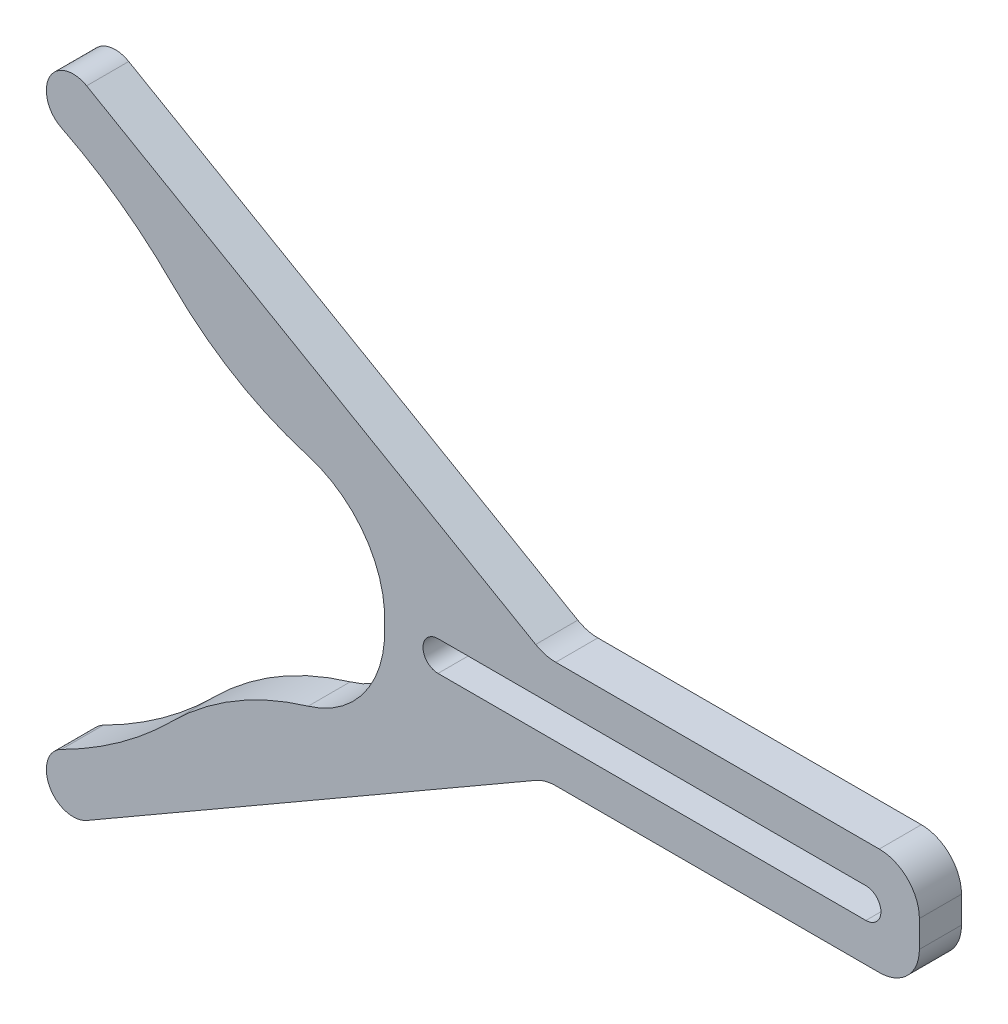
ISO-10303-21;
HEADER;
FILE_DESCRIPTION(('STEP AP214'),'2;1');
FILE_NAME('part.step','',(''),(''),'','','');
FILE_SCHEMA(('AUTOMOTIVE_DESIGN { 1 0 10303 214 1 1 1 1 }'));
ENDSEC;
DATA;
#1=APPLICATION_CONTEXT('core data for automotive mechanical design processes');
#2=APPLICATION_PROTOCOL_DEFINITION('international standard','automotive_design',2000,#1);
#3=PRODUCT_CONTEXT('',#1,'mechanical');
#4=PRODUCT('Part','Part','',(#3));
#5=PRODUCT_RELATED_PRODUCT_CATEGORY('part','',(#4));
#6=PRODUCT_DEFINITION_FORMATION('','',#4);
#7=PRODUCT_DEFINITION_CONTEXT('part definition',#1,'design');
#8=PRODUCT_DEFINITION('design','',#6,#7);
#9=PRODUCT_DEFINITION_SHAPE('','',#8);
#10=(LENGTH_UNIT() NAMED_UNIT(*) SI_UNIT(.MILLI.,.METRE.));
#11=(NAMED_UNIT(*) PLANE_ANGLE_UNIT() SI_UNIT($,.RADIAN.));
#12=(NAMED_UNIT(*) SI_UNIT($,.STERADIAN.) SOLID_ANGLE_UNIT());
#13=UNCERTAINTY_MEASURE_WITH_UNIT(LENGTH_MEASURE(1.E-05),#10,'distance_accuracy_value','');
#14=(GEOMETRIC_REPRESENTATION_CONTEXT(3) GLOBAL_UNCERTAINTY_ASSIGNED_CONTEXT((#13)) GLOBAL_UNIT_ASSIGNED_CONTEXT((#10,
#11,#12)) REPRESENTATION_CONTEXT('',''));
#15=CARTESIAN_POINT('',(0.,0.,0.));
#16=DIRECTION('',(0.,0.,1.));
#17=DIRECTION('',(1.,0.,0.));
#18=AXIS2_PLACEMENT_3D('',#15,#16,#17);
#19=CARTESIAN_POINT('',(-7.04849999999996,-133.35,0.));
#20=DIRECTION('',(0.,0.,1.));
#21=DIRECTION('',(1.,0.,0.));
#22=AXIS2_PLACEMENT_3D('',#19,#20,#21);
#23=PLANE('',#22);
#24=DIRECTION('',(1.,0.,0.));
#25=VECTOR('',#24,1.);
#26=CARTESIAN_POINT('',(126.3015,-8.33437499999997,0.));
#27=LINE('',#26,#25);
#28=CARTESIAN_POINT('',(24.7015,-8.334375,0.));
#29=VERTEX_POINT('',#28);
#30=CARTESIAN_POINT('',(126.3015,-8.33437499999997,0.));
#31=VERTEX_POINT('',#30);
#32=EDGE_CURVE('E213',#29,#31,#27,.T.);
#33=ORIENTED_EDGE('',*,*,#32,.T.);
#34=CARTESIAN_POINT('',(126.3015,-4.76249999999999,0.));
#35=DIRECTION('',(0.,0.,1.));
#36=DIRECTION('',(-1.,0.,0.));
#37=AXIS2_PLACEMENT_3D('',#34,#35,#36);
#38=CIRCLE('',#37,3.571875);
#39=CARTESIAN_POINT('',(126.3015,-1.19062499999997,0.));
#40=VERTEX_POINT('',#39);
#41=EDGE_CURVE('E205',#31,#40,#38,.T.);
#42=ORIENTED_EDGE('',*,*,#41,.T.);
#43=DIRECTION('',(-1.,0.,0.));
#44=VECTOR('',#43,1.);
#45=CARTESIAN_POINT('',(126.3015,-1.19062499999997,0.));
#46=LINE('',#45,#44);
#47=CARTESIAN_POINT('',(24.7015,-1.19062499999997,0.));
#48=VERTEX_POINT('',#47);
#49=EDGE_CURVE('E217',#40,#48,#46,.T.);
#50=ORIENTED_EDGE('',*,*,#49,.T.);
#51=CARTESIAN_POINT('',(24.7015,-4.7625,0.));
#52=DIRECTION('',(0.,0.,1.));
#53=DIRECTION('',(1.,0.,0.));
#54=AXIS2_PLACEMENT_3D('',#51,#52,#53);
#55=CIRCLE('',#54,3.571875);
#56=EDGE_CURVE('E221',#48,#29,#55,.T.);
#57=ORIENTED_EDGE('',*,*,#56,.T.);
#58=EDGE_LOOP('',(#33,#42,#50,#57));
#59=FACE_BOUND('',#58,.T.);
#60=DIRECTION('',(-0.866025403784438,-0.500000000000001,0.));
#61=VECTOR('',#60,1.);
#62=CARTESIAN_POINT('',(-42.9417594905346,-71.1810509131405,0.));
#63=LINE('',#62,#61);
#64=CARTESIAN_POINT('',(47.8912160579065,-18.7386080289532,0.));
#65=VERTEX_POINT('',#64);
#66=CARTESIAN_POINT('',(-58.7375,-80.3007259483298,0.));
#67=VERTEX_POINT('',#66);
#68=EDGE_CURVE('E258',#65,#67,#63,.T.);
#69=ORIENTED_EDGE('',*,*,#68,.T.);
#70=CARTESIAN_POINT('',(-61.9125,-74.8014646342987,0.));
#71=DIRECTION('',(0.,0.,1.));
#72=DIRECTION('',(1.,0.,0.));
#73=AXIS2_PLACEMENT_3D('',#70,#71,#72);
#74=CIRCLE('',#73,6.35);
#75=CARTESIAN_POINT('',(-68.2625,-74.8014646342987,0.));
#76=VERTEX_POINT('',#75);
#77=EDGE_CURVE('E407',#67,#76,#74,.F.);
#78=ORIENTED_EDGE('',*,*,#77,.T.);
#79=DIRECTION('',(0.,1.,0.));
#80=VECTOR('',#79,1.);
#81=CARTESIAN_POINT('',(-68.2625,-76.2,0.));
#82=LINE('',#81,#80);
#83=CARTESIAN_POINT('',(-68.2625,-74.375116540716,0.));
#84=VERTEX_POINT('',#83);
#85=EDGE_CURVE('E275',#76,#84,#82,.T.);
#86=ORIENTED_EDGE('',*,*,#85,.T.);
#87=CARTESIAN_POINT('',(-61.9125,-74.375116540716,0.));
#88=DIRECTION('',(0.,0.,-1.));
#89=DIRECTION('',(-1.,0.,0.));
#90=AXIS2_PLACEMENT_3D('',#87,#88,#89);
#91=CIRCLE('',#90,6.34999999999997);
#92=CARTESIAN_POINT('',(-64.7523099037181,-68.6955056640146,0.));
#93=VERTEX_POINT('',#92);
#94=EDGE_CURVE('E279',#93,#84,#91,.F.);
#95=ORIENTED_EDGE('',*,*,#94,.F.);
#96=CARTESIAN_POINT('',(-110.189268363208,22.1782683632083,0.));
#97=DIRECTION('',(0.,0.,-1.));
#98=DIRECTION('',(-1.,0.,0.));
#99=AXIS2_PLACEMENT_3D('',#96,#97,#98);
#100=CIRCLE('',#99,101.600000000001);
#101=CARTESIAN_POINT('',(-38.3472193946545,-49.6637806053459,0.));
#102=VERTEX_POINT('',#101);
#103=EDGE_CURVE('E282',#93,#102,#100,.F.);
#104=ORIENTED_EDGE('',*,*,#103,.T.);
#105=CARTESIAN_POINT('',(15.5343173317604,-103.545317331762,0.));
#106=DIRECTION('',(0.,0.,-1.));
#107=DIRECTION('',(-1.,0.,0.));
#108=AXIS2_PLACEMENT_3D('',#105,#106,#107);
#109=CIRCLE('',#108,76.2000000000004);
#110=CARTESIAN_POINT('',(-6.13722318006472,-30.4920194469679,0.));
#111=VERTEX_POINT('',#110);
#112=EDGE_CURVE('E286',#111,#102,#109,.F.);
#113=ORIENTED_EDGE('',*,*,#112,.F.);
#114=CARTESIAN_POINT('',(-13.3610700173397,-6.1409201520368,0.));
#115=DIRECTION('',(0.,0.,-1.));
#116=DIRECTION('',(-1.,0.,0.));
#117=AXIS2_PLACEMENT_3D('',#114,#115,#116);
#118=CIRCLE('',#117,25.4);
#119=CARTESIAN_POINT('',(12.0015,-4.76250000000001,0.));
#120=VERTEX_POINT('',#119);
#121=EDGE_CURVE('E289',#111,#120,#118,.F.);
#122=ORIENTED_EDGE('',*,*,#121,.T.);
#123=CARTESIAN_POINT('',(-13.3610700173397,-3.38407984796313,0.));
#124=DIRECTION('',(0.,0.,-1.));
#125=DIRECTION('',(-1.,0.,0.));
#126=AXIS2_PLACEMENT_3D('',#123,#124,#125);
#127=CIRCLE('',#126,25.4);
#128=CARTESIAN_POINT('',(-6.13722318006467,20.9670194469679,0.));
#129=VERTEX_POINT('',#128);
#130=EDGE_CURVE('E290',#120,#129,#127,.F.);
#131=ORIENTED_EDGE('',*,*,#130,.T.);
#132=CARTESIAN_POINT('',(15.5343173317605,94.0203173317616,0.));
#133=DIRECTION('',(0.,0.,-1.));
#134=DIRECTION('',(-1.,0.,0.));
#135=AXIS2_PLACEMENT_3D('',#132,#133,#134);
#136=CIRCLE('',#135,76.2000000000005);
#137=CARTESIAN_POINT('',(-38.3472193946544,40.1387806053459,0.));
#138=VERTEX_POINT('',#137);
#139=EDGE_CURVE('E296',#138,#129,#136,.F.);
#140=ORIENTED_EDGE('',*,*,#139,.F.);
#141=CARTESIAN_POINT('',(-110.189268363207,-31.703268363207,0.));
#142=DIRECTION('',(0.,0.,-1.));
#143=DIRECTION('',(-1.,0.,0.));
#144=AXIS2_PLACEMENT_3D('',#141,#142,#143);
#145=CIRCLE('',#144,101.599999999999);
#146=CARTESIAN_POINT('',(-64.752309903718,59.1705056640146,0.));
#147=VERTEX_POINT('',#146);
#148=EDGE_CURVE('E299',#138,#147,#145,.F.);
#149=ORIENTED_EDGE('',*,*,#148,.T.);
#150=CARTESIAN_POINT('',(-61.9125,64.850116540716,0.));
#151=DIRECTION('',(0.,0.,-1.));
#152=DIRECTION('',(-1.,0.,0.));
#153=AXIS2_PLACEMENT_3D('',#150,#151,#152);
#154=CIRCLE('',#153,6.35000000000001);
#155=CARTESIAN_POINT('',(-68.2625,64.8501164231919,0.));
#156=VERTEX_POINT('',#155);
#157=EDGE_CURVE('E303',#156,#147,#154,.F.);
#158=ORIENTED_EDGE('',*,*,#157,.F.);
#159=DIRECTION('',(-3.70154599632154E-08,0.999999999999999,0.));
#160=VECTOR('',#159,1.);
#161=CARTESIAN_POINT('',(-68.2625,64.8501165407159,0.));
#162=LINE('',#161,#160);
#163=CARTESIAN_POINT('',(-68.2625000157815,65.2764644083618,0.));
#164=VERTEX_POINT('',#163);
#165=EDGE_CURVE('E316',#156,#164,#162,.T.);
#166=ORIENTED_EDGE('',*,*,#165,.T.);
#167=CARTESIAN_POINT('',(-61.9125000157815,65.27646464341,0.));
#168=DIRECTION('',(0.,0.,1.));
#169=DIRECTION('',(1.,0.,0.));
#170=AXIS2_PLACEMENT_3D('',#167,#168,#169);
#171=CIRCLE('',#170,6.35);
#172=CARTESIAN_POINT('',(-58.7375000157815,70.7757259574412,0.));
#173=VERTEX_POINT('',#172);
#174=EDGE_CURVE('E405',#164,#173,#171,.F.);
#175=ORIENTED_EDGE('',*,*,#174,.T.);
#176=DIRECTION('',(0.866025403784438,-0.500000000000001,0.));
#177=VECTOR('',#176,1.);
#178=CARTESIAN_POINT('',(68.418282118597,-2.63769908685979,0.));
#179=LINE('',#178,#177);
#180=CARTESIAN_POINT('',(47.8912160579064,9.21360802895321,0.));
#181=VERTEX_POINT('',#180);
#182=EDGE_CURVE('E261',#173,#181,#179,.T.);
#183=ORIENTED_EDGE('',*,*,#182,.T.);
#184=CARTESIAN_POINT('',(52.6537160579064,17.4625,0.));
#185=DIRECTION('',(0.,0.,1.));
#186=DIRECTION('',(1.,0.,0.));
#187=AXIS2_PLACEMENT_3D('',#184,#185,#186);
#188=CIRCLE('',#187,9.525);
#189=CARTESIAN_POINT('',(52.6537160579064,7.93749999999996,0.));
#190=VERTEX_POINT('',#189);
#191=EDGE_CURVE('E396',#181,#190,#188,.T.);
#192=ORIENTED_EDGE('',*,*,#191,.T.);
#193=DIRECTION('',(1.,0.,0.));
#194=VECTOR('',#193,1.);
#195=CARTESIAN_POINT('',(-7.04850000000004,7.93749999999993,0.));
#196=LINE('',#195,#194);
#197=CARTESIAN_POINT('',(129.4765,7.93750000000001,0.));
#198=VERTEX_POINT('',#197);
#199=EDGE_CURVE('E252',#190,#198,#196,.T.);
#200=ORIENTED_EDGE('',*,*,#199,.T.);
#201=CARTESIAN_POINT('',(129.4765,-1.58749999999999,0.));
#202=DIRECTION('',(0.,0.,1.));
#203=DIRECTION('',(1.,0.,0.));
#204=AXIS2_PLACEMENT_3D('',#201,#202,#203);
#205=CIRCLE('',#204,9.525);
#206=CARTESIAN_POINT('',(139.0015,-1.58749999999999,0.));
#207=VERTEX_POINT('',#206);
#208=EDGE_CURVE('E383',#198,#207,#205,.F.);
#209=ORIENTED_EDGE('',*,*,#208,.T.);
#210=DIRECTION('',(0.,-1.,0.));
#211=VECTOR('',#210,1.);
#212=CARTESIAN_POINT('',(139.0015,147.6375,0.));
#213=LINE('',#212,#211);
#214=CARTESIAN_POINT('',(139.0015,-7.93749999999999,0.));
#215=VERTEX_POINT('',#214);
#216=EDGE_CURVE('E263',#207,#215,#213,.T.);
#217=ORIENTED_EDGE('',*,*,#216,.T.);
#218=CARTESIAN_POINT('',(129.4765,-7.93749999999998,0.));
#219=DIRECTION('',(0.,0.,1.));
#220=DIRECTION('',(1.,0.,0.));
#221=AXIS2_PLACEMENT_3D('',#218,#219,#220);
#222=CIRCLE('',#221,9.525);
#223=CARTESIAN_POINT('',(129.4765,-17.4625,0.));
#224=VERTEX_POINT('',#223);
#225=EDGE_CURVE('E381',#215,#224,#222,.F.);
#226=ORIENTED_EDGE('',*,*,#225,.T.);
#227=DIRECTION('',(-1.,0.,0.));
#228=VECTOR('',#227,1.);
#229=CARTESIAN_POINT('',(-7.04849999999995,-17.4625,0.));
#230=LINE('',#229,#228);
#231=CARTESIAN_POINT('',(52.6537160579065,-17.4625,0.));
#232=VERTEX_POINT('',#231);
#233=EDGE_CURVE('E255',#224,#232,#230,.T.);
#234=ORIENTED_EDGE('',*,*,#233,.T.);
#235=CARTESIAN_POINT('',(52.6537160579065,-26.9875,0.));
#236=DIRECTION('',(0.,0.,1.));
#237=DIRECTION('',(1.,0.,0.));
#238=AXIS2_PLACEMENT_3D('',#235,#236,#237);
#239=CIRCLE('',#238,9.525);
#240=EDGE_CURVE('E400',#232,#65,#239,.T.);
#241=ORIENTED_EDGE('',*,*,#240,.T.);
#242=EDGE_LOOP('',(#69,#78,#86,#95,#104,#113,#122,#131,#140,#149,#158,#166,#175,#183,#192,#200,
#209,#217,#226,#234,#241));
#243=FACE_BOUND('',#242,.T.);
#244=ADVANCED_FACE('F35',(#59,#243),#23,.F.);
#245=CARTESIAN_POINT('',(139.0015,147.6375,10.));
#246=DIRECTION('',(-1.,0.,0.));
#247=DIRECTION('',(0.,-1.,0.));
#248=AXIS2_PLACEMENT_3D('',#245,#246,#247);
#249=PLANE('',#248);
#250=ORIENTED_EDGE('',*,*,#216,.F.);
#251=DIRECTION('',(0.,0.,1.));
#252=VECTOR('',#251,1.);
#253=CARTESIAN_POINT('',(139.0015,-1.58749999999999,10.));
#254=LINE('',#253,#252);
#255=CARTESIAN_POINT('',(139.0015,-1.58749999999999,10.));
#256=VERTEX_POINT('',#255);
#257=EDGE_CURVE('E369',#207,#256,#254,.T.);
#258=ORIENTED_EDGE('',*,*,#257,.T.);
#259=DIRECTION('',(0.,1.,0.));
#260=VECTOR('',#259,1.);
#261=CARTESIAN_POINT('',(139.0015,-133.35,10.));
#262=LINE('',#261,#260);
#263=CARTESIAN_POINT('',(139.0015,-7.93749999999999,10.));
#264=VERTEX_POINT('',#263);
#265=EDGE_CURVE('E272',#264,#256,#262,.T.);
#266=ORIENTED_EDGE('',*,*,#265,.F.);
#267=DIRECTION('',(0.,0.,1.));
#268=VECTOR('',#267,1.);
#269=CARTESIAN_POINT('',(139.0015,-7.93749999999999,10.));
#270=LINE('',#269,#268);
#271=EDGE_CURVE('E317',#264,#215,#270,.F.);
#272=ORIENTED_EDGE('',*,*,#271,.T.);
#273=EDGE_LOOP('',(#250,#258,#266,#272));
#274=FACE_BOUND('',#273,.T.);
#275=ADVANCED_FACE('F424',(#274),#249,.F.);
#276=CARTESIAN_POINT('',(-68.2625,64.8501165407159,10.));
#277=DIRECTION('',(0.999999999999999,3.70154599632154E-08,0.));
#278=DIRECTION('',(-3.70154599632154E-08,0.999999999999999,0.));
#279=AXIS2_PLACEMENT_3D('',#276,#277,#278);
#280=PLANE('',#279);
#281=DIRECTION('',(0.,1.,0.));
#282=VECTOR('',#281,1.);
#283=CARTESIAN_POINT('',(-68.2625004201211,-133.35,10.));
#284=LINE('',#283,#282);
#285=CARTESIAN_POINT('',(-68.2625004201211,65.2764644083618,10.));
#286=VERTEX_POINT('',#285);
#287=CARTESIAN_POINT('',(-68.2625002100605,64.850116540716,10.));
#288=VERTEX_POINT('',#287);
#289=EDGE_CURVE('E269',#286,#288,#284,.F.);
#290=ORIENTED_EDGE('',*,*,#289,.F.);
#291=DIRECTION('',(0.,0.,1.));
#292=VECTOR('',#291,1.);
#293=CARTESIAN_POINT('',(-68.2625000157815,65.2764644083618,10.));
#294=LINE('',#293,#292);
#295=EDGE_CURVE('E11',#286,#164,#294,.F.);
#296=ORIENTED_EDGE('',*,*,#295,.T.);
#297=ORIENTED_EDGE('',*,*,#165,.F.);
#298=DIRECTION('',(0.,0.,-1.));
#299=VECTOR('',#298,1.);
#300=CARTESIAN_POINT('',(-68.2625,64.850116540716,10.));
#301=LINE('',#300,#299);
#302=EDGE_CURVE('E300',#288,#156,#301,.T.);
#303=ORIENTED_EDGE('',*,*,#302,.F.);
#304=EDGE_LOOP('',(#290,#296,#297,#303));
#305=FACE_BOUND('',#304,.T.);
#306=ADVANCED_FACE('F426',(#305),#280,.F.);
#307=CARTESIAN_POINT('',(-61.9125,64.850116540716,10.));
#308=DIRECTION('',(0.,0.,-1.));
#309=DIRECTION('',(-1.,0.,0.));
#310=AXIS2_PLACEMENT_3D('',#307,#308,#309);
#311=CYLINDRICAL_SURFACE('',#310,6.35000000000001);
#312=CARTESIAN_POINT('',(-61.9125,64.850116540716,10.));
#313=DIRECTION('',(0.,0.,-1.));
#314=DIRECTION('',(-1.,0.,0.));
#315=AXIS2_PLACEMENT_3D('',#312,#313,#314);
#316=CIRCLE('',#315,6.35000000000001);
#317=CARTESIAN_POINT('',(-64.752309903718,59.1705056640146,10.));
#318=VERTEX_POINT('',#317);
#319=EDGE_CURVE('E271',#288,#318,#316,.F.);
#320=ORIENTED_EDGE('',*,*,#319,.F.);
#321=ORIENTED_EDGE('',*,*,#302,.T.);
#322=ORIENTED_EDGE('',*,*,#157,.T.);
#323=DIRECTION('',(0.,0.,-1.));
#324=VECTOR('',#323,1.);
#325=CARTESIAN_POINT('',(-64.752309903718,59.1705056640145,10.));
#326=LINE('',#325,#324);
#327=EDGE_CURVE('E297',#147,#318,#326,.F.);
#328=ORIENTED_EDGE('',*,*,#327,.T.);
#329=EDGE_LOOP('',(#320,#321,#322,#328));
#330=FACE_BOUND('',#329,.T.);
#331=ADVANCED_FACE('F433',(#330),#311,.T.);
#332=CARTESIAN_POINT('',(-110.189268363207,-31.703268363207,10.));
#333=DIRECTION('',(0.,0.,-1.));
#334=DIRECTION('',(-1.,0.,0.));
#335=AXIS2_PLACEMENT_3D('',#332,#333,#334);
#336=CYLINDRICAL_SURFACE('',#335,101.599999999999);
#337=DIRECTION('',(0.,0.,-1.));
#338=VECTOR('',#337,1.);
#339=CARTESIAN_POINT('',(-38.3472193946543,40.1387806053458,10.));
#340=LINE('',#339,#338);
#341=CARTESIAN_POINT('',(-38.3472193946544,40.1387806053459,10.));
#342=VERTEX_POINT('',#341);
#343=EDGE_CURVE('E293',#342,#138,#340,.T.);
#344=ORIENTED_EDGE('',*,*,#343,.F.);
#345=CARTESIAN_POINT('',(-110.189268363207,-31.703268363207,10.));
#346=DIRECTION('',(0.,0.,-1.));
#347=DIRECTION('',(-1.,0.,0.));
#348=AXIS2_PLACEMENT_3D('',#345,#346,#347);
#349=CIRCLE('',#348,101.599999999999);
#350=EDGE_CURVE('E338',#318,#342,#349,.T.);
#351=ORIENTED_EDGE('',*,*,#350,.F.);
#352=ORIENTED_EDGE('',*,*,#327,.F.);
#353=ORIENTED_EDGE('',*,*,#148,.F.);
#354=EDGE_LOOP('',(#344,#351,#352,#353));
#355=FACE_BOUND('',#354,.T.);
#356=ADVANCED_FACE('F474',(#355),#336,.F.);
#357=CARTESIAN_POINT('',(15.5343173317605,94.0203173317616,10.));
#358=DIRECTION('',(0.,0.,-1.));
#359=DIRECTION('',(-1.,0.,0.));
#360=AXIS2_PLACEMENT_3D('',#357,#358,#359);
#361=CYLINDRICAL_SURFACE('',#360,76.2000000000005);
#362=CARTESIAN_POINT('',(15.5343173317605,94.0203173317616,10.));
#363=DIRECTION('',(0.,0.,-1.));
#364=DIRECTION('',(-1.,0.,0.));
#365=AXIS2_PLACEMENT_3D('',#362,#363,#364);
#366=CIRCLE('',#365,76.2000000000005);
#367=CARTESIAN_POINT('',(-6.13722318006467,20.9670194469679,10.));
#368=VERTEX_POINT('',#367);
#369=EDGE_CURVE('E335',#342,#368,#366,.F.);
#370=ORIENTED_EDGE('',*,*,#369,.F.);
#371=ORIENTED_EDGE('',*,*,#343,.T.);
#372=ORIENTED_EDGE('',*,*,#139,.T.);
#373=DIRECTION('',(0.,0.,-1.));
#374=VECTOR('',#373,1.);
#375=CARTESIAN_POINT('',(-6.13722318006467,20.9670194469679,10.));
#376=LINE('',#375,#374);
#377=EDGE_CURVE('E291',#129,#368,#376,.F.);
#378=ORIENTED_EDGE('',*,*,#377,.T.);
#379=EDGE_LOOP('',(#370,#371,#372,#378));
#380=FACE_BOUND('',#379,.T.);
#381=ADVANCED_FACE('F470',(#380),#361,.T.);
#382=CARTESIAN_POINT('',(-13.3610700173397,-3.38407984796313,10.));
#383=DIRECTION('',(0.,0.,-1.));
#384=DIRECTION('',(-1.,0.,0.));
#385=AXIS2_PLACEMENT_3D('',#382,#383,#384);
#386=CYLINDRICAL_SURFACE('',#385,25.4);
#387=DIRECTION('',(0.,0.,-1.));
#388=VECTOR('',#387,1.);
#389=CARTESIAN_POINT('',(12.0015,-4.7625,10.));
#390=LINE('',#389,#388);
#391=CARTESIAN_POINT('',(12.0015,-4.76250000000001,10.));
#392=VERTEX_POINT('',#391);
#393=EDGE_CURVE('E287',#120,#392,#390,.F.);
#394=ORIENTED_EDGE('',*,*,#393,.T.);
#395=CARTESIAN_POINT('',(-13.3610700173397,-3.38407984796313,10.));
#396=DIRECTION('',(0.,0.,-1.));
#397=DIRECTION('',(-1.,0.,0.));
#398=AXIS2_PLACEMENT_3D('',#395,#396,#397);
#399=CIRCLE('',#398,25.4);
#400=EDGE_CURVE('E332',#368,#392,#399,.T.);
#401=ORIENTED_EDGE('',*,*,#400,.F.);
#402=ORIENTED_EDGE('',*,*,#377,.F.);
#403=ORIENTED_EDGE('',*,*,#130,.F.);
#404=EDGE_LOOP('',(#394,#401,#402,#403));
#405=FACE_BOUND('',#404,.T.);
#406=ADVANCED_FACE('F466',(#405),#386,.F.);
#407=CARTESIAN_POINT('',(-13.3610700173397,-6.1409201520368,10.));
#408=DIRECTION('',(0.,0.,-1.));
#409=DIRECTION('',(-1.,0.,0.));
#410=AXIS2_PLACEMENT_3D('',#407,#408,#409);
#411=CYLINDRICAL_SURFACE('',#410,25.4);
#412=DIRECTION('',(0.,0.,-1.));
#413=VECTOR('',#412,1.);
#414=CARTESIAN_POINT('',(-6.13722318006473,-30.4920194469679,10.));
#415=LINE('',#414,#413);
#416=CARTESIAN_POINT('',(-6.13722318006472,-30.4920194469679,10.));
#417=VERTEX_POINT('',#416);
#418=EDGE_CURVE('E283',#417,#111,#415,.T.);
#419=ORIENTED_EDGE('',*,*,#418,.F.);
#420=CARTESIAN_POINT('',(-13.3610700173397,-6.1409201520368,10.));
#421=DIRECTION('',(0.,0.,-1.));
#422=DIRECTION('',(-1.,0.,0.));
#423=AXIS2_PLACEMENT_3D('',#420,#421,#422);
#424=CIRCLE('',#423,25.4);
#425=EDGE_CURVE('E329',#392,#417,#424,.T.);
#426=ORIENTED_EDGE('',*,*,#425,.F.);
#427=ORIENTED_EDGE('',*,*,#393,.F.);
#428=ORIENTED_EDGE('',*,*,#121,.F.);
#429=EDGE_LOOP('',(#419,#426,#427,#428));
#430=FACE_BOUND('',#429,.T.);
#431=ADVANCED_FACE('F462',(#430),#411,.F.);
#432=CARTESIAN_POINT('',(15.5343173317604,-103.545317331762,10.));
#433=DIRECTION('',(0.,0.,-1.));
#434=DIRECTION('',(-1.,0.,0.));
#435=AXIS2_PLACEMENT_3D('',#432,#433,#434);
#436=CYLINDRICAL_SURFACE('',#435,76.2000000000004);
#437=CARTESIAN_POINT('',(15.5343173317604,-103.545317331762,10.));
#438=DIRECTION('',(0.,0.,-1.));
#439=DIRECTION('',(-1.,0.,0.));
#440=AXIS2_PLACEMENT_3D('',#437,#438,#439);
#441=CIRCLE('',#440,76.2000000000004);
#442=CARTESIAN_POINT('',(-38.3472193946545,-49.6637806053459,10.));
#443=VERTEX_POINT('',#442);
#444=EDGE_CURVE('E326',#417,#443,#441,.F.);
#445=ORIENTED_EDGE('',*,*,#444,.F.);
#446=ORIENTED_EDGE('',*,*,#418,.T.);
#447=ORIENTED_EDGE('',*,*,#112,.T.);
#448=DIRECTION('',(0.,0.,-1.));
#449=VECTOR('',#448,1.);
#450=CARTESIAN_POINT('',(-38.3472193946544,-49.6637806053459,10.));
#451=LINE('',#450,#449);
#452=EDGE_CURVE('E280',#102,#443,#451,.F.);
#453=ORIENTED_EDGE('',*,*,#452,.T.);
#454=EDGE_LOOP('',(#445,#446,#447,#453));
#455=FACE_BOUND('',#454,.T.);
#456=ADVANCED_FACE('F458',(#455),#436,.T.);
#457=CARTESIAN_POINT('',(-110.189268363208,22.1782683632083,10.));
#458=DIRECTION('',(0.,0.,-1.));
#459=DIRECTION('',(-1.,0.,0.));
#460=AXIS2_PLACEMENT_3D('',#457,#458,#459);
#461=CYLINDRICAL_SURFACE('',#460,101.600000000001);
#462=DIRECTION('',(0.,0.,-1.));
#463=VECTOR('',#462,1.);
#464=CARTESIAN_POINT('',(-64.7523099037181,-68.6955056640146,10.));
#465=LINE('',#464,#463);
#466=CARTESIAN_POINT('',(-64.7523099037181,-68.6955056640146,10.));
#467=VERTEX_POINT('',#466);
#468=EDGE_CURVE('E276',#467,#93,#465,.T.);
#469=ORIENTED_EDGE('',*,*,#468,.F.);
#470=CARTESIAN_POINT('',(-110.189268363208,22.1782683632083,10.));
#471=DIRECTION('',(0.,0.,-1.));
#472=DIRECTION('',(-1.,0.,0.));
#473=AXIS2_PLACEMENT_3D('',#470,#471,#472);
#474=CIRCLE('',#473,101.600000000001);
#475=EDGE_CURVE('E323',#443,#467,#474,.T.);
#476=ORIENTED_EDGE('',*,*,#475,.F.);
#477=ORIENTED_EDGE('',*,*,#452,.F.);
#478=ORIENTED_EDGE('',*,*,#103,.F.);
#479=EDGE_LOOP('',(#469,#476,#477,#478));
#480=FACE_BOUND('',#479,.T.);
#481=ADVANCED_FACE('F454',(#480),#461,.F.);
#482=CARTESIAN_POINT('',(-61.9125,-74.375116540716,10.));
#483=DIRECTION('',(0.,0.,-1.));
#484=DIRECTION('',(-1.,0.,0.));
#485=AXIS2_PLACEMENT_3D('',#482,#483,#484);
#486=CYLINDRICAL_SURFACE('',#485,6.34999999999997);
#487=CARTESIAN_POINT('',(-61.9125,-74.375116540716,10.));
#488=DIRECTION('',(0.,0.,-1.));
#489=DIRECTION('',(-1.,0.,0.));
#490=AXIS2_PLACEMENT_3D('',#487,#488,#489);
#491=CIRCLE('',#490,6.34999999999997);
#492=CARTESIAN_POINT('',(-68.2625,-74.375116540716,10.));
#493=VERTEX_POINT('',#492);
#494=EDGE_CURVE('E268',#467,#493,#491,.F.);
#495=ORIENTED_EDGE('',*,*,#494,.F.);
#496=ORIENTED_EDGE('',*,*,#468,.T.);
#497=ORIENTED_EDGE('',*,*,#94,.T.);
#498=DIRECTION('',(0.,0.,-1.));
#499=VECTOR('',#498,1.);
#500=CARTESIAN_POINT('',(-68.2625,-74.375116540716,10.));
#501=LINE('',#500,#499);
#502=EDGE_CURVE('E273',#84,#493,#501,.F.);
#503=ORIENTED_EDGE('',*,*,#502,.T.);
#504=EDGE_LOOP('',(#495,#496,#497,#503));
#505=FACE_BOUND('',#504,.T.);
#506=ADVANCED_FACE('F447',(#505),#486,.T.);
#507=CARTESIAN_POINT('',(-68.2625,-76.2,10.));
#508=DIRECTION('',(1.,0.,0.));
#509=DIRECTION('',(0.,0.,-1.));
#510=AXIS2_PLACEMENT_3D('',#507,#508,#509);
#511=PLANE('',#510);
#512=ORIENTED_EDGE('',*,*,#85,.F.);
#513=DIRECTION('',(0.,0.,-1.));
#514=VECTOR('',#513,1.);
#515=CARTESIAN_POINT('',(-68.2625,-74.8014646342987,10.));
#516=LINE('',#515,#514);
#517=CARTESIAN_POINT('',(-68.2625,-74.8014646342987,10.));
#518=VERTEX_POINT('',#517);
#519=EDGE_CURVE('E409',#76,#518,#516,.F.);
#520=ORIENTED_EDGE('',*,*,#519,.T.);
#521=DIRECTION('',(0.,1.,0.));
#522=VECTOR('',#521,1.);
#523=CARTESIAN_POINT('',(-68.2625,-133.35,10.));
#524=LINE('',#523,#522);
#525=EDGE_CURVE('E264',#493,#518,#524,.F.);
#526=ORIENTED_EDGE('',*,*,#525,.F.);
#527=ORIENTED_EDGE('',*,*,#502,.F.);
#528=EDGE_LOOP('',(#512,#520,#526,#527));
#529=FACE_BOUND('',#528,.T.);
#530=ADVANCED_FACE('F439',(#529),#511,.F.);
#531=CARTESIAN_POINT('',(-7.04849999999996,-133.35,10.));
#532=DIRECTION('',(0.,0.,1.));
#533=DIRECTION('',(1.,0.,0.));
#534=AXIS2_PLACEMENT_3D('',#531,#532,#533);
#535=PLANE('',#534);
#536=CARTESIAN_POINT('',(126.3015,-4.76249999999999,10.));
#537=DIRECTION('',(0.,0.,1.));
#538=DIRECTION('',(-1.,0.,0.));
#539=AXIS2_PLACEMENT_3D('',#536,#537,#538);
#540=CIRCLE('',#539,3.571875);
#541=CARTESIAN_POINT('',(126.3015,-8.33437499999997,10.));
#542=VERTEX_POINT('',#541);
#543=CARTESIAN_POINT('',(126.3015,-1.19062499999997,10.));
#544=VERTEX_POINT('',#543);
#545=EDGE_CURVE('E208',#542,#544,#540,.T.);
#546=ORIENTED_EDGE('',*,*,#545,.F.);
#547=DIRECTION('',(1.,0.,0.));
#548=VECTOR('',#547,1.);
#549=CARTESIAN_POINT('',(126.3015,-8.33437499999997,10.));
#550=LINE('',#549,#548);
#551=CARTESIAN_POINT('',(24.7015,-8.334375,10.));
#552=VERTEX_POINT('',#551);
#553=EDGE_CURVE('E225',#552,#542,#550,.T.);
#554=ORIENTED_EDGE('',*,*,#553,.F.);
#555=CARTESIAN_POINT('',(24.7015,-4.7625,10.));
#556=DIRECTION('',(0.,0.,1.));
#557=DIRECTION('',(1.,0.,0.));
#558=AXIS2_PLACEMENT_3D('',#555,#556,#557);
#559=CIRCLE('',#558,3.571875);
#560=CARTESIAN_POINT('',(24.7015,-1.19062499999997,10.));
#561=VERTEX_POINT('',#560);
#562=EDGE_CURVE('E228',#561,#552,#559,.T.);
#563=ORIENTED_EDGE('',*,*,#562,.F.);
#564=DIRECTION('',(-1.,0.,0.));
#565=VECTOR('',#564,1.);
#566=CARTESIAN_POINT('',(126.3015,-1.19062499999997,10.));
#567=LINE('',#566,#565);
#568=EDGE_CURVE('E234',#544,#561,#567,.T.);
#569=ORIENTED_EDGE('',*,*,#568,.F.);
#570=EDGE_LOOP('',(#546,#554,#563,#569));
#571=FACE_BOUND('',#570,.T.);
#572=ORIENTED_EDGE('',*,*,#525,.T.);
#573=CARTESIAN_POINT('',(-61.9125,-74.8014646342987,10.));
#574=DIRECTION('',(0.,0.,1.));
#575=DIRECTION('',(1.,0.,0.));
#576=AXIS2_PLACEMENT_3D('',#573,#574,#575);
#577=CIRCLE('',#576,6.35);
#578=CARTESIAN_POINT('',(-58.7375,-80.3007259483298,10.));
#579=VERTEX_POINT('',#578);
#580=EDGE_CURVE('E412',#518,#579,#577,.T.);
#581=ORIENTED_EDGE('',*,*,#580,.T.);
#582=DIRECTION('',(-0.866025403784438,-0.500000000000001,0.));
#583=VECTOR('',#582,1.);
#584=CARTESIAN_POINT('',(-108.740301808159,-109.169857032506,10.));
#585=LINE('',#584,#583);
#586=CARTESIAN_POINT('',(47.8912160579065,-18.7386080289532,10.));
#587=VERTEX_POINT('',#586);
#588=EDGE_CURVE('E249',#587,#579,#585,.T.);
#589=ORIENTED_EDGE('',*,*,#588,.F.);
#590=CARTESIAN_POINT('',(52.6537160579065,-26.9875,10.));
#591=DIRECTION('',(0.,0.,1.));
#592=DIRECTION('',(1.,0.,0.));
#593=AXIS2_PLACEMENT_3D('',#590,#591,#592);
#594=CIRCLE('',#593,9.525);
#595=CARTESIAN_POINT('',(52.6537160579065,-17.4625,10.));
#596=VERTEX_POINT('',#595);
#597=EDGE_CURVE('E398',#587,#596,#594,.F.);
#598=ORIENTED_EDGE('',*,*,#597,.T.);
#599=DIRECTION('',(-1.,0.,0.));
#600=VECTOR('',#599,1.);
#601=CARTESIAN_POINT('',(50.1015,-17.4625,10.));
#602=LINE('',#601,#600);
#603=CARTESIAN_POINT('',(129.4765,-17.4625,10.));
#604=VERTEX_POINT('',#603);
#605=EDGE_CURVE('E246',#604,#596,#602,.T.);
#606=ORIENTED_EDGE('',*,*,#605,.F.);
#607=CARTESIAN_POINT('',(129.4765,-7.93749999999998,10.));
#608=DIRECTION('',(0.,0.,1.));
#609=DIRECTION('',(1.,0.,0.));
#610=AXIS2_PLACEMENT_3D('',#607,#608,#609);
#611=CIRCLE('',#610,9.525);
#612=EDGE_CURVE('E375',#604,#264,#611,.T.);
#613=ORIENTED_EDGE('',*,*,#612,.T.);
#614=ORIENTED_EDGE('',*,*,#265,.T.);
#615=CARTESIAN_POINT('',(129.4765,-1.58749999999999,10.));
#616=DIRECTION('',(0.,0.,1.));
#617=DIRECTION('',(1.,0.,0.));
#618=AXIS2_PLACEMENT_3D('',#615,#616,#617);
#619=CIRCLE('',#618,9.525);
#620=CARTESIAN_POINT('',(129.4765,7.93750000000001,10.));
#621=VERTEX_POINT('',#620);
#622=EDGE_CURVE('E377',#256,#621,#619,.T.);
#623=ORIENTED_EDGE('',*,*,#622,.T.);
#624=DIRECTION('',(1.,0.,0.));
#625=VECTOR('',#624,1.);
#626=CARTESIAN_POINT('',(139.0015,7.93750000000002,10.));
#627=LINE('',#626,#625);
#628=CARTESIAN_POINT('',(52.6537160579064,7.93749999999997,10.));
#629=VERTEX_POINT('',#628);
#630=EDGE_CURVE('E240',#629,#621,#627,.T.);
#631=ORIENTED_EDGE('',*,*,#630,.F.);
#632=CARTESIAN_POINT('',(52.6537160579064,17.4625,10.));
#633=DIRECTION('',(0.,0.,1.));
#634=DIRECTION('',(1.,0.,0.));
#635=AXIS2_PLACEMENT_3D('',#632,#633,#634);
#636=CIRCLE('',#635,9.525);
#637=CARTESIAN_POINT('',(47.8912160579064,9.21360802895321,10.));
#638=VERTEX_POINT('',#637);
#639=EDGE_CURVE('E393',#629,#638,#636,.F.);
#640=ORIENTED_EDGE('',*,*,#639,.T.);
#641=DIRECTION('',(0.866025403784438,-0.500000000000001,0.));
#642=VECTOR('',#641,1.);
#643=CARTESIAN_POINT('',(68.418282118597,-2.63769908685979,10.));
#644=LINE('',#643,#642);
#645=CARTESIAN_POINT('',(-58.7375000157815,70.7757259574412,10.));
#646=VERTEX_POINT('',#645);
#647=EDGE_CURVE('E267',#646,#638,#644,.T.);
#648=ORIENTED_EDGE('',*,*,#647,.F.);
#649=CARTESIAN_POINT('',(-61.9125000157815,65.27646464341,10.));
#650=DIRECTION('',(0.,0.,1.));
#651=DIRECTION('',(1.,0.,0.));
#652=AXIS2_PLACEMENT_3D('',#649,#650,#651);
#653=CIRCLE('',#652,6.35);
#654=EDGE_CURVE('E50',#646,#286,#653,.T.);
#655=ORIENTED_EDGE('',*,*,#654,.T.);
#656=ORIENTED_EDGE('',*,*,#289,.T.);
#657=ORIENTED_EDGE('',*,*,#319,.T.);
#658=ORIENTED_EDGE('',*,*,#350,.T.);
#659=ORIENTED_EDGE('',*,*,#369,.T.);
#660=ORIENTED_EDGE('',*,*,#400,.T.);
#661=ORIENTED_EDGE('',*,*,#425,.T.);
#662=ORIENTED_EDGE('',*,*,#444,.T.);
#663=ORIENTED_EDGE('',*,*,#475,.T.);
#664=ORIENTED_EDGE('',*,*,#494,.T.);
#665=EDGE_LOOP('',(#572,#581,#589,#598,#606,#613,#614,#623,#631,#640,#648,#655,#656,#657,#658,
#659,#660,#661,#662,#663,#664));
#666=FACE_BOUND('',#665,.T.);
#667=ADVANCED_FACE('F415',(#571,#666),#535,.T.);
#668=CARTESIAN_POINT('',(139.0015,7.93750000000002,-0.000103077640640006));
#669=DIRECTION('',(0.,-1.,0.));
#670=DIRECTION('',(1.,0.,0.));
#671=AXIS2_PLACEMENT_3D('',#668,#669,#670);
#672=PLANE('',#671);
#673=ORIENTED_EDGE('',*,*,#199,.F.);
#674=DIRECTION('',(0.,0.,1.));
#675=VECTOR('',#674,1.);
#676=CARTESIAN_POINT('',(52.6537160579064,7.93749999999997,10.));
#677=LINE('',#676,#675);
#678=EDGE_CURVE('E358',#190,#629,#677,.T.);
#679=ORIENTED_EDGE('',*,*,#678,.T.);
#680=ORIENTED_EDGE('',*,*,#630,.T.);
#681=DIRECTION('',(0.,0.,1.));
#682=VECTOR('',#681,1.);
#683=CARTESIAN_POINT('',(129.4765,7.93750000000001,-0.000103077640640006));
#684=LINE('',#683,#682);
#685=EDGE_CURVE('E357',#621,#198,#684,.F.);
#686=ORIENTED_EDGE('',*,*,#685,.T.);
#687=EDGE_LOOP('',(#673,#679,#680,#686));
#688=FACE_BOUND('',#687,.T.);
#689=ADVANCED_FACE('F419',(#688),#672,.F.);
#690=CARTESIAN_POINT('',(50.1015,7.93749999999997,-0.000103077640640006));
#691=DIRECTION('',(-0.500000000000001,-0.866025403784438,0.));
#692=DIRECTION('',(0.866025403784438,-0.500000000000001,0.));
#693=AXIS2_PLACEMENT_3D('',#690,#691,#692);
#694=PLANE('',#693);
#695=ORIENTED_EDGE('',*,*,#182,.F.);
#696=DIRECTION('',(0.,0.,1.));
#697=VECTOR('',#696,1.);
#698=CARTESIAN_POINT('',(-58.7375000157814,70.7757259574412,-0.000103077640640006));
#699=LINE('',#698,#697);
#700=EDGE_CURVE('E43',#173,#646,#699,.T.);
#701=ORIENTED_EDGE('',*,*,#700,.T.);
#702=ORIENTED_EDGE('',*,*,#647,.T.);
#703=DIRECTION('',(0.,0.,1.));
#704=VECTOR('',#703,1.);
#705=CARTESIAN_POINT('',(47.8912160579064,9.2136080289532,0.));
#706=LINE('',#705,#704);
#707=EDGE_CURVE('E311',#638,#181,#706,.F.);
#708=ORIENTED_EDGE('',*,*,#707,.T.);
#709=EDGE_LOOP('',(#695,#701,#702,#708));
#710=FACE_BOUND('',#709,.T.);
#711=ADVANCED_FACE('F413',(#710),#694,.F.);
#712=CARTESIAN_POINT('',(-108.740301808159,-109.169857032506,-0.000103077640640006));
#713=DIRECTION('',(-0.500000000000001,0.866025403784438,0.));
#714=DIRECTION('',(-0.866025403784438,-0.500000000000001,0.));
#715=AXIS2_PLACEMENT_3D('',#712,#713,#714);
#716=PLANE('',#715);
#717=ORIENTED_EDGE('',*,*,#588,.T.);
#718=DIRECTION('',(0.,0.,-1.));
#719=VECTOR('',#718,1.);
#720=CARTESIAN_POINT('',(-58.7375,-80.3007259483298,-0.000103077640640006));
#721=LINE('',#720,#719);
#722=EDGE_CURVE('E402',#579,#67,#721,.T.);
#723=ORIENTED_EDGE('',*,*,#722,.T.);
#724=ORIENTED_EDGE('',*,*,#68,.F.);
#725=DIRECTION('',(0.,0.,1.));
#726=VECTOR('',#725,1.);
#727=CARTESIAN_POINT('',(47.8912160579064,-18.7386080289532,10.));
#728=LINE('',#727,#726);
#729=EDGE_CURVE('E390',#65,#587,#728,.T.);
#730=ORIENTED_EDGE('',*,*,#729,.T.);
#731=EDGE_LOOP('',(#717,#723,#724,#730));
#732=FACE_BOUND('',#731,.T.);
#733=ADVANCED_FACE('F519',(#732),#716,.F.);
#734=CARTESIAN_POINT('',(50.1015,-17.4625,-0.000103077640640006));
#735=DIRECTION('',(0.,1.,0.));
#736=DIRECTION('',(-1.,0.,0.));
#737=AXIS2_PLACEMENT_3D('',#734,#735,#736);
#738=PLANE('',#737);
#739=ORIENTED_EDGE('',*,*,#233,.F.);
#740=DIRECTION('',(0.,0.,1.));
#741=VECTOR('',#740,1.);
#742=CARTESIAN_POINT('',(129.4765,-17.4625,-0.000103077640640006));
#743=LINE('',#742,#741);
#744=EDGE_CURVE('E387',#224,#604,#743,.T.);
#745=ORIENTED_EDGE('',*,*,#744,.T.);
#746=ORIENTED_EDGE('',*,*,#605,.T.);
#747=DIRECTION('',(0.,0.,1.));
#748=VECTOR('',#747,1.);
#749=CARTESIAN_POINT('',(52.6537160579065,-17.4625,0.));
#750=LINE('',#749,#748);
#751=EDGE_CURVE('E385',#596,#232,#750,.F.);
#752=ORIENTED_EDGE('',*,*,#751,.T.);
#753=EDGE_LOOP('',(#739,#745,#746,#752));
#754=FACE_BOUND('',#753,.T.);
#755=ADVANCED_FACE('F514',(#754),#738,.F.);
#756=CARTESIAN_POINT('',(52.6537160579064,17.4625,-0.000103077640640006));
#757=DIRECTION('',(0.,0.,-1.));
#758=DIRECTION('',(-1.,0.,0.));
#759=AXIS2_PLACEMENT_3D('',#756,#757,#758);
#760=CYLINDRICAL_SURFACE('',#759,9.525);
#761=ORIENTED_EDGE('',*,*,#191,.F.);
#762=ORIENTED_EDGE('',*,*,#707,.F.);
#763=ORIENTED_EDGE('',*,*,#639,.F.);
#764=ORIENTED_EDGE('',*,*,#678,.F.);
#765=EDGE_LOOP('',(#761,#762,#763,#764));
#766=FACE_BOUND('',#765,.T.);
#767=ADVANCED_FACE('F417',(#766),#760,.F.);
#768=CARTESIAN_POINT('',(129.4765,-1.58749999999999,10.));
#769=DIRECTION('',(0.,0.,1.));
#770=DIRECTION('',(1.,0.,0.));
#771=AXIS2_PLACEMENT_3D('',#768,#769,#770);
#772=CYLINDRICAL_SURFACE('',#771,9.525);
#773=ORIENTED_EDGE('',*,*,#208,.F.);
#774=ORIENTED_EDGE('',*,*,#685,.F.);
#775=ORIENTED_EDGE('',*,*,#622,.F.);
#776=ORIENTED_EDGE('',*,*,#257,.F.);
#777=EDGE_LOOP('',(#773,#774,#775,#776));
#778=FACE_BOUND('',#777,.T.);
#779=ADVANCED_FACE('F422',(#778),#772,.T.);
#780=CARTESIAN_POINT('',(129.4765,-7.93749999999998,-0.000103077640640006));
#781=DIRECTION('',(0.,0.,1.));
#782=DIRECTION('',(1.,0.,0.));
#783=AXIS2_PLACEMENT_3D('',#780,#781,#782);
#784=CYLINDRICAL_SURFACE('',#783,9.525);
#785=ORIENTED_EDGE('',*,*,#225,.F.);
#786=ORIENTED_EDGE('',*,*,#271,.F.);
#787=ORIENTED_EDGE('',*,*,#612,.F.);
#788=ORIENTED_EDGE('',*,*,#744,.F.);
#789=EDGE_LOOP('',(#785,#786,#787,#788));
#790=FACE_BOUND('',#789,.T.);
#791=ADVANCED_FACE('F506',(#790),#784,.T.);
#792=CARTESIAN_POINT('',(52.6537160579065,-26.9875,-0.000103077640640006));
#793=DIRECTION('',(0.,0.,-1.));
#794=DIRECTION('',(-1.,0.,0.));
#795=AXIS2_PLACEMENT_3D('',#792,#793,#794);
#796=CYLINDRICAL_SURFACE('',#795,9.525);
#797=ORIENTED_EDGE('',*,*,#240,.F.);
#798=ORIENTED_EDGE('',*,*,#751,.F.);
#799=ORIENTED_EDGE('',*,*,#597,.F.);
#800=ORIENTED_EDGE('',*,*,#729,.F.);
#801=EDGE_LOOP('',(#797,#798,#799,#800));
#802=FACE_BOUND('',#801,.T.);
#803=ADVANCED_FACE('F503',(#802),#796,.F.);
#804=CARTESIAN_POINT('',(126.3015,-4.76249999999999,0.));
#805=DIRECTION('',(0.,0.,1.));
#806=DIRECTION('',(1.,0.,0.));
#807=AXIS2_PLACEMENT_3D('',#804,#805,#806);
#808=CYLINDRICAL_SURFACE('',#807,3.571875);
#809=ORIENTED_EDGE('',*,*,#545,.T.);
#810=DIRECTION('',(0.,0.,1.));
#811=VECTOR('',#810,1.);
#812=CARTESIAN_POINT('',(126.3015,-1.19062499999997,0.));
#813=LINE('',#812,#811);
#814=EDGE_CURVE('E201',#40,#544,#813,.T.);
#815=ORIENTED_EDGE('',*,*,#814,.F.);
#816=ORIENTED_EDGE('',*,*,#41,.F.);
#817=DIRECTION('',(0.,0.,1.));
#818=VECTOR('',#817,1.);
#819=CARTESIAN_POINT('',(126.3015,-8.33437499999997,0.));
#820=LINE('',#819,#818);
#821=EDGE_CURVE('E238',#31,#542,#820,.T.);
#822=ORIENTED_EDGE('',*,*,#821,.T.);
#823=EDGE_LOOP('',(#809,#815,#816,#822));
#824=FACE_BOUND('',#823,.T.);
#825=ADVANCED_FACE('F203',(#824),#808,.F.);
#826=CARTESIAN_POINT('',(126.3015,-8.33437499999997,0.));
#827=DIRECTION('',(0.,-1.,0.));
#828=DIRECTION('',(0.,0.,-1.));
#829=AXIS2_PLACEMENT_3D('',#826,#827,#828);
#830=PLANE('',#829);
#831=ORIENTED_EDGE('',*,*,#553,.T.);
#832=ORIENTED_EDGE('',*,*,#821,.F.);
#833=ORIENTED_EDGE('',*,*,#32,.F.);
#834=DIRECTION('',(0.,0.,1.));
#835=VECTOR('',#834,1.);
#836=CARTESIAN_POINT('',(24.7015,-8.334375,0.));
#837=LINE('',#836,#835);
#838=EDGE_CURVE('E241',#29,#552,#837,.T.);
#839=ORIENTED_EDGE('',*,*,#838,.T.);
#840=EDGE_LOOP('',(#831,#832,#833,#839));
#841=FACE_BOUND('',#840,.T.);
#842=ADVANCED_FACE('F529',(#841),#830,.F.);
#843=CARTESIAN_POINT('',(24.7015,-4.7625,0.));
#844=DIRECTION('',(0.,0.,1.));
#845=DIRECTION('',(1.,0.,0.));
#846=AXIS2_PLACEMENT_3D('',#843,#844,#845);
#847=CYLINDRICAL_SURFACE('',#846,3.571875);
#848=ORIENTED_EDGE('',*,*,#562,.T.);
#849=ORIENTED_EDGE('',*,*,#838,.F.);
#850=ORIENTED_EDGE('',*,*,#56,.F.);
#851=DIRECTION('',(0.,0.,1.));
#852=VECTOR('',#851,1.);
#853=CARTESIAN_POINT('',(24.7015,-1.19062499999997,0.));
#854=LINE('',#853,#852);
#855=EDGE_CURVE('E212',#48,#561,#854,.T.);
#856=ORIENTED_EDGE('',*,*,#855,.T.);
#857=EDGE_LOOP('',(#848,#849,#850,#856));
#858=FACE_BOUND('',#857,.T.);
#859=ADVANCED_FACE('F499',(#858),#847,.F.);
#860=CARTESIAN_POINT('',(126.3015,-1.19062499999997,0.));
#861=DIRECTION('',(0.,1.,0.));
#862=DIRECTION('',(0.,0.,1.));
#863=AXIS2_PLACEMENT_3D('',#860,#861,#862);
#864=PLANE('',#863);
#865=ORIENTED_EDGE('',*,*,#568,.T.);
#866=ORIENTED_EDGE('',*,*,#855,.F.);
#867=ORIENTED_EDGE('',*,*,#49,.F.);
#868=ORIENTED_EDGE('',*,*,#814,.T.);
#869=EDGE_LOOP('',(#865,#866,#867,#868));
#870=FACE_BOUND('',#869,.T.);
#871=ADVANCED_FACE('F218',(#870),#864,.F.);
#872=CARTESIAN_POINT('',(-61.9125,-74.8014646342987,-0.000103077640640006));
#873=DIRECTION('',(0.,0.,-1.));
#874=DIRECTION('',(-1.,0.,0.));
#875=AXIS2_PLACEMENT_3D('',#872,#873,#874);
#876=CYLINDRICAL_SURFACE('',#875,6.35);
#877=ORIENTED_EDGE('',*,*,#580,.F.);
#878=ORIENTED_EDGE('',*,*,#519,.F.);
#879=ORIENTED_EDGE('',*,*,#77,.F.);
#880=ORIENTED_EDGE('',*,*,#722,.F.);
#881=EDGE_LOOP('',(#877,#878,#879,#880));
#882=FACE_BOUND('',#881,.T.);
#883=ADVANCED_FACE('F491',(#882),#876,.T.);
#884=CARTESIAN_POINT('',(-61.9125000157815,65.27646464341,-0.000103077640640006));
#885=DIRECTION('',(0.,0.,1.));
#886=DIRECTION('',(1.,0.,0.));
#887=AXIS2_PLACEMENT_3D('',#884,#885,#886);
#888=CYLINDRICAL_SURFACE('',#887,6.35);
#889=ORIENTED_EDGE('',*,*,#174,.F.);
#890=ORIENTED_EDGE('',*,*,#295,.F.);
#891=ORIENTED_EDGE('',*,*,#654,.F.);
#892=ORIENTED_EDGE('',*,*,#700,.F.);
#893=EDGE_LOOP('',(#889,#890,#891,#892));
#894=FACE_BOUND('',#893,.T.);
#895=ADVANCED_FACE('F37',(#894),#888,.T.);
#896=CLOSED_SHELL('',(#244,#275,#306,#331,#356,#381,#406,#431,#456,#481,#506,#530,#667,#689,
#711,#733,#755,#767,#779,#791,#803,#825,#842,#859,#871,#883,#895));
#897=MANIFOLD_SOLID_BREP('B2',#896);
#898=ADVANCED_BREP_SHAPE_REPRESENTATION('',(#18,#897),#14);
#899=SHAPE_DEFINITION_REPRESENTATION(#9,#898);
ENDSEC;
END-ISO-10303-21;
